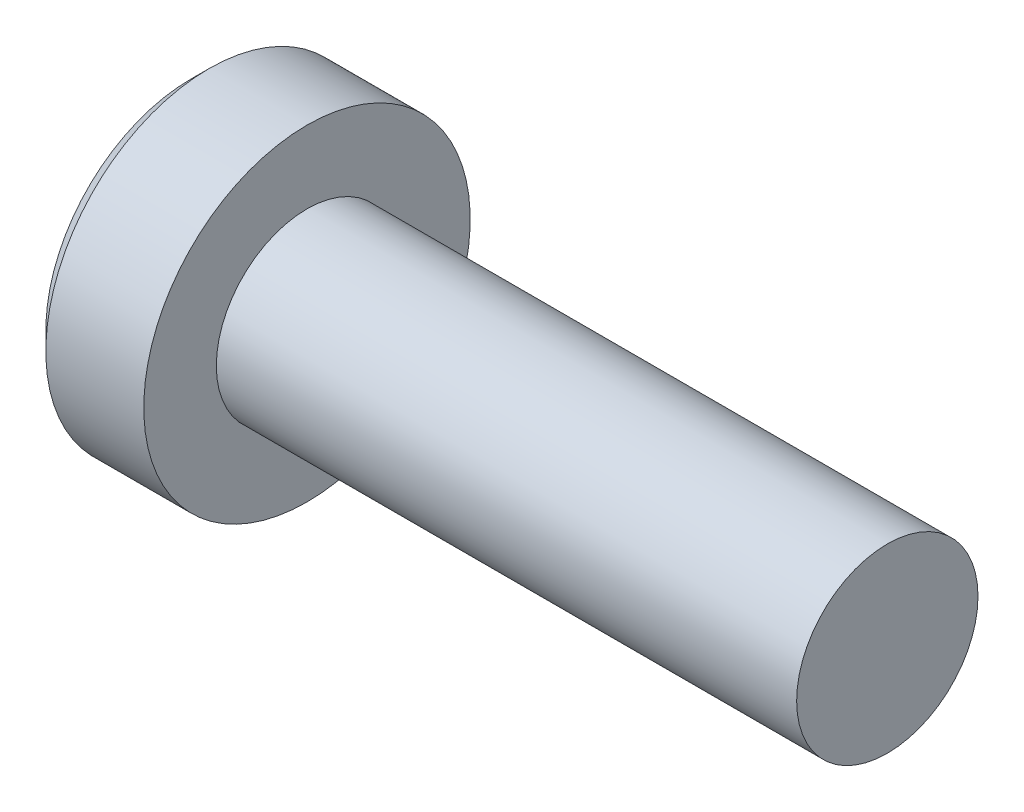
ISO-10303-21;
HEADER;
FILE_DESCRIPTION(('STEP AP214'),'2;1');
FILE_NAME('part.step','',(''),(''),'','','');
FILE_SCHEMA(('AUTOMOTIVE_DESIGN { 1 0 10303 214 1 1 1 1 }'));
ENDSEC;
DATA;
#1=APPLICATION_CONTEXT('core data for automotive mechanical design processes');
#2=APPLICATION_PROTOCOL_DEFINITION('international standard','automotive_design',2000,#1);
#3=PRODUCT_CONTEXT('',#1,'mechanical');
#4=PRODUCT('Part','Part','',(#3));
#5=PRODUCT_RELATED_PRODUCT_CATEGORY('part','',(#4));
#6=PRODUCT_DEFINITION_FORMATION('','',#4);
#7=PRODUCT_DEFINITION_CONTEXT('part definition',#1,'design');
#8=PRODUCT_DEFINITION('design','',#6,#7);
#9=PRODUCT_DEFINITION_SHAPE('','',#8);
#10=(LENGTH_UNIT() NAMED_UNIT(*) SI_UNIT(.MILLI.,.METRE.));
#11=(NAMED_UNIT(*) PLANE_ANGLE_UNIT() SI_UNIT($,.RADIAN.));
#12=(NAMED_UNIT(*) SI_UNIT($,.STERADIAN.) SOLID_ANGLE_UNIT());
#13=UNCERTAINTY_MEASURE_WITH_UNIT(LENGTH_MEASURE(1.E-05),#10,'distance_accuracy_value','');
#14=(GEOMETRIC_REPRESENTATION_CONTEXT(3) GLOBAL_UNCERTAINTY_ASSIGNED_CONTEXT((#13)) GLOBAL_UNIT_ASSIGNED_CONTEXT((#10,
#11,#12)) REPRESENTATION_CONTEXT('',''));
#15=CARTESIAN_POINT('',(0.,0.,0.));
#16=DIRECTION('',(0.,0.,1.));
#17=DIRECTION('',(1.,0.,0.));
#18=AXIS2_PLACEMENT_3D('',#15,#16,#17);
#19=CARTESIAN_POINT('',(-0.5,0.,0.));
#20=DIRECTION('',(-1.,0.,0.));
#21=DIRECTION('',(0.,0.,1.));
#22=AXIS2_PLACEMENT_3D('',#19,#20,#21);
#23=PLANE('',#22);
#24=CARTESIAN_POINT('',(-0.5,0.,0.));
#25=DIRECTION('',(-1.,0.,0.));
#26=DIRECTION('',(0.,-1.,0.));
#27=AXIS2_PLACEMENT_3D('',#24,#25,#26);
#28=CIRCLE('',#27,1.);
#29=CARTESIAN_POINT('',(-0.5,-0.866025403784439,0.5));
#30=VERTEX_POINT('',#29);
#31=CARTESIAN_POINT('',(-0.5,0.,1.));
#32=VERTEX_POINT('',#31);
#33=EDGE_CURVE('E187',#30,#32,#28,.T.);
#34=ORIENTED_EDGE('',*,*,#33,.F.);
#35=DIRECTION('',(0.,0.5,0.866025403784439));
#36=VECTOR('',#35,1.);
#37=CARTESIAN_POINT('',(-0.5,-1.15470053837925,0.));
#38=LINE('',#37,#36);
#39=CARTESIAN_POINT('',(-0.5,-0.577350269189627,0.999999999999999));
#40=VERTEX_POINT('',#39);
#41=EDGE_CURVE('E247',#30,#40,#38,.T.);
#42=ORIENTED_EDGE('',*,*,#41,.T.);
#43=DIRECTION('',(0.,1.,0.));
#44=VECTOR('',#43,1.);
#45=CARTESIAN_POINT('',(-0.5,-0.577350269189627,0.999999999999999));
#46=LINE('',#45,#44);
#47=EDGE_CURVE('E206',#40,#32,#46,.T.);
#48=ORIENTED_EDGE('',*,*,#47,.T.);
#49=EDGE_LOOP('',(#34,#42,#48));
#50=FACE_BOUND('',#49,.T.);
#51=ADVANCED_FACE('F38',(#50),#23,.T.);
#52=CARTESIAN_POINT('',(-0.5,0.866025403784439,0.5));
#53=VERTEX_POINT('',#52);
#54=EDGE_CURVE('E193',#32,#53,#28,.T.);
#55=ORIENTED_EDGE('',*,*,#54,.F.);
#56=CARTESIAN_POINT('',(-0.5,0.577350269189627,0.999999999999999));
#57=VERTEX_POINT('',#56);
#58=EDGE_CURVE('E240',#32,#57,#46,.T.);
#59=ORIENTED_EDGE('',*,*,#58,.T.);
#60=DIRECTION('',(0.,0.5,-0.866025403784439));
#61=VECTOR('',#60,1.);
#62=CARTESIAN_POINT('',(-0.5,0.577350269189627,0.999999999999999));
#63=LINE('',#62,#61);
#64=EDGE_CURVE('E261',#57,#53,#63,.T.);
#65=ORIENTED_EDGE('',*,*,#64,.T.);
#66=EDGE_LOOP('',(#55,#59,#65));
#67=FACE_BOUND('',#66,.T.);
#68=ADVANCED_FACE('F125',(#67),#23,.T.);
#69=CARTESIAN_POINT('',(-0.5,0.866025403784439,-0.5));
#70=VERTEX_POINT('',#69);
#71=EDGE_CURVE('E195',#53,#70,#28,.T.);
#72=ORIENTED_EDGE('',*,*,#71,.F.);
#73=CARTESIAN_POINT('',(-0.5,1.15470053837925,0.));
#74=VERTEX_POINT('',#73);
#75=EDGE_CURVE('E220',#53,#74,#63,.T.);
#76=ORIENTED_EDGE('',*,*,#75,.T.);
#77=DIRECTION('',(0.,-0.5,-0.866025403784439));
#78=VECTOR('',#77,1.);
#79=CARTESIAN_POINT('',(-0.5,1.15470053837925,0.));
#80=LINE('',#79,#78);
#81=EDGE_CURVE('E258',#74,#70,#80,.T.);
#82=ORIENTED_EDGE('',*,*,#81,.T.);
#83=EDGE_LOOP('',(#72,#76,#82));
#84=FACE_BOUND('',#83,.T.);
#85=ADVANCED_FACE('F130',(#84),#23,.T.);
#86=CARTESIAN_POINT('',(-0.5,0.,-1.));
#87=VERTEX_POINT('',#86);
#88=EDGE_CURVE('E198',#70,#87,#28,.T.);
#89=ORIENTED_EDGE('',*,*,#88,.F.);
#90=CARTESIAN_POINT('',(-0.5,0.577350269189626,-1.));
#91=VERTEX_POINT('',#90);
#92=EDGE_CURVE('E260',#70,#91,#80,.T.);
#93=ORIENTED_EDGE('',*,*,#92,.T.);
#94=DIRECTION('',(0.,-1.,0.));
#95=VECTOR('',#94,1.);
#96=CARTESIAN_POINT('',(-0.5,0.577350269189626,-1.));
#97=LINE('',#96,#95);
#98=EDGE_CURVE('E254',#91,#87,#97,.T.);
#99=ORIENTED_EDGE('',*,*,#98,.T.);
#100=EDGE_LOOP('',(#89,#93,#99));
#101=FACE_BOUND('',#100,.T.);
#102=ADVANCED_FACE('F177',(#101),#23,.T.);
#103=CARTESIAN_POINT('',(-0.5,-0.866025403784439,-0.5));
#104=VERTEX_POINT('',#103);
#105=EDGE_CURVE('E53',#87,#104,#28,.T.);
#106=ORIENTED_EDGE('',*,*,#105,.F.);
#107=CARTESIAN_POINT('',(-0.5,-0.577350269189626,-1.));
#108=VERTEX_POINT('',#107);
#109=EDGE_CURVE('E257',#87,#108,#97,.T.);
#110=ORIENTED_EDGE('',*,*,#109,.T.);
#111=DIRECTION('',(0.,-0.5,0.866025403784439));
#112=VECTOR('',#111,1.);
#113=CARTESIAN_POINT('',(-0.5,-0.577350269189626,-1.));
#114=LINE('',#113,#112);
#115=EDGE_CURVE('E249',#108,#104,#114,.T.);
#116=ORIENTED_EDGE('',*,*,#115,.T.);
#117=EDGE_LOOP('',(#106,#110,#116));
#118=FACE_BOUND('',#117,.T.);
#119=ADVANCED_FACE('F123',(#118),#23,.T.);
#120=CARTESIAN_POINT('',(8.,0.,0.));
#121=DIRECTION('',(-1.,0.,0.));
#122=DIRECTION('',(0.,-1.,0.));
#123=AXIS2_PLACEMENT_3D('',#120,#121,#122);
#124=PLANE('',#123);
#125=CARTESIAN_POINT('',(8.,0.,0.));
#126=DIRECTION('',(-1.,0.,0.));
#127=DIRECTION('',(0.,-1.,0.));
#128=AXIS2_PLACEMENT_3D('',#125,#126,#127);
#129=CIRCLE('',#128,1.25);
#130=CARTESIAN_POINT('',(8.,-1.25,0.));
#131=VERTEX_POINT('',#130);
#132=EDGE_CURVE('E181',#131,#131,#129,.T.);
#133=ORIENTED_EDGE('',*,*,#132,.F.);
#134=EDGE_LOOP('',(#133));
#135=FACE_BOUND('',#134,.T.);
#136=ADVANCED_FACE('F170',(#135),#124,.F.);
#137=CARTESIAN_POINT('',(-1.6,0.,0.));
#138=DIRECTION('',(-1.,0.,0.));
#139=DIRECTION('',(0.,-1.,0.));
#140=AXIS2_PLACEMENT_3D('',#137,#138,#139);
#141=CYLINDRICAL_SURFACE('',#140,1.25);
#142=CARTESIAN_POINT('',(0.,0.,0.));
#143=DIRECTION('',(-1.,0.,0.));
#144=DIRECTION('',(0.,-1.,0.));
#145=AXIS2_PLACEMENT_3D('',#142,#143,#144);
#146=CIRCLE('',#145,1.25);
#147=CARTESIAN_POINT('',(0.,-1.25,0.));
#148=VERTEX_POINT('',#147);
#149=EDGE_CURVE('E184',#148,#148,#146,.T.);
#150=ORIENTED_EDGE('',*,*,#149,.F.);
#151=EDGE_LOOP('',(#150));
#152=FACE_BOUND('',#151,.T.);
#153=ORIENTED_EDGE('',*,*,#132,.T.);
#154=EDGE_LOOP('',(#153));
#155=FACE_BOUND('',#154,.T.);
#156=ADVANCED_FACE('F167',(#152,#155),#141,.T.);
#157=CARTESIAN_POINT('',(0.,1.25,0.));
#158=DIRECTION('',(-1.,0.,0.));
#159=DIRECTION('',(0.,-1.,0.));
#160=AXIS2_PLACEMENT_3D('',#157,#158,#159);
#161=PLANE('',#160);
#162=CARTESIAN_POINT('',(0.,0.,0.));
#163=DIRECTION('',(-1.,0.,0.));
#164=DIRECTION('',(0.,-1.,0.));
#165=AXIS2_PLACEMENT_3D('',#162,#163,#164);
#166=CIRCLE('',#165,2.25);
#167=CARTESIAN_POINT('',(0.,-2.25,0.));
#168=VERTEX_POINT('',#167);
#169=EDGE_CURVE('E189',#168,#168,#166,.T.);
#170=ORIENTED_EDGE('',*,*,#169,.F.);
#171=EDGE_LOOP('',(#170));
#172=FACE_BOUND('',#171,.T.);
#173=ORIENTED_EDGE('',*,*,#149,.T.);
#174=EDGE_LOOP('',(#173));
#175=FACE_BOUND('',#174,.T.);
#176=ADVANCED_FACE('F163',(#172,#175),#161,.F.);
#177=CARTESIAN_POINT('',(-1.6,0.,0.));
#178=DIRECTION('',(-1.,0.,0.));
#179=DIRECTION('',(0.,-1.,0.));
#180=AXIS2_PLACEMENT_3D('',#177,#178,#179);
#181=CYLINDRICAL_SURFACE('',#180,2.25);
#182=CARTESIAN_POINT('',(-1.35,0.,0.));
#183=DIRECTION('',(1.,0.,0.));
#184=DIRECTION('',(0.,1.,0.));
#185=AXIS2_PLACEMENT_3D('',#182,#183,#184);
#186=CIRCLE('',#185,2.25);
#187=CARTESIAN_POINT('',(-1.35,2.25,0.));
#188=VERTEX_POINT('',#187);
#189=EDGE_CURVE('E11',#188,#188,#186,.T.);
#190=ORIENTED_EDGE('',*,*,#189,.T.);
#191=EDGE_LOOP('',(#190));
#192=FACE_BOUND('',#191,.T.);
#193=ORIENTED_EDGE('',*,*,#169,.T.);
#194=EDGE_LOOP('',(#193));
#195=FACE_BOUND('',#194,.T.);
#196=ADVANCED_FACE('F159',(#192,#195),#181,.T.);
#197=CARTESIAN_POINT('',(-1.6,2.25,0.));
#198=DIRECTION('',(1.,0.,0.));
#199=DIRECTION('',(0.,1.,0.));
#200=AXIS2_PLACEMENT_3D('',#197,#198,#199);
#201=PLANE('',#200);
#202=CARTESIAN_POINT('',(-1.6,0.,0.));
#203=DIRECTION('',(1.,0.,0.));
#204=DIRECTION('',(0.,1.,0.));
#205=AXIS2_PLACEMENT_3D('',#202,#203,#204);
#206=CIRCLE('',#205,2.);
#207=CARTESIAN_POINT('',(-1.6,2.,0.));
#208=VERTEX_POINT('',#207);
#209=EDGE_CURVE('E46',#208,#208,#206,.F.);
#210=ORIENTED_EDGE('',*,*,#209,.T.);
#211=EDGE_LOOP('',(#210));
#212=FACE_BOUND('',#211,.T.);
#213=DIRECTION('',(0.,-0.5,-0.866025403784439));
#214=VECTOR('',#213,1.);
#215=CARTESIAN_POINT('',(-1.6,1.15470053837925,0.));
#216=LINE('',#215,#214);
#217=CARTESIAN_POINT('',(-1.6,1.15470053837925,0.));
#218=VERTEX_POINT('',#217);
#219=CARTESIAN_POINT('',(-1.6,0.577350269189626,-1.));
#220=VERTEX_POINT('',#219);
#221=EDGE_CURVE('E200',#218,#220,#216,.T.);
#222=ORIENTED_EDGE('',*,*,#221,.F.);
#223=DIRECTION('',(0.,0.5,-0.866025403784439));
#224=VECTOR('',#223,1.);
#225=CARTESIAN_POINT('',(-1.6,0.577350269189627,0.999999999999999));
#226=LINE('',#225,#224);
#227=CARTESIAN_POINT('',(-1.6,0.577350269189627,0.999999999999999));
#228=VERTEX_POINT('',#227);
#229=EDGE_CURVE('E61',#228,#218,#226,.T.);
#230=ORIENTED_EDGE('',*,*,#229,.F.);
#231=DIRECTION('',(0.,1.,0.));
#232=VECTOR('',#231,1.);
#233=CARTESIAN_POINT('',(-1.6,-0.577350269189627,0.999999999999999));
#234=LINE('',#233,#232);
#235=CARTESIAN_POINT('',(-1.6,-0.577350269189627,0.999999999999999));
#236=VERTEX_POINT('',#235);
#237=EDGE_CURVE('E217',#236,#228,#234,.T.);
#238=ORIENTED_EDGE('',*,*,#237,.F.);
#239=DIRECTION('',(0.,0.5,0.866025403784439));
#240=VECTOR('',#239,1.);
#241=CARTESIAN_POINT('',(-1.6,-1.15470053837925,0.));
#242=LINE('',#241,#240);
#243=CARTESIAN_POINT('',(-1.6,-1.15470053837925,0.));
#244=VERTEX_POINT('',#243);
#245=EDGE_CURVE('E214',#244,#236,#242,.T.);
#246=ORIENTED_EDGE('',*,*,#245,.F.);
#247=DIRECTION('',(0.,-0.5,0.866025403784439));
#248=VECTOR('',#247,1.);
#249=CARTESIAN_POINT('',(-1.6,-0.577350269189626,-1.));
#250=LINE('',#249,#248);
#251=CARTESIAN_POINT('',(-1.6,-0.577350269189626,-1.));
#252=VERTEX_POINT('',#251);
#253=EDGE_CURVE('E211',#252,#244,#250,.T.);
#254=ORIENTED_EDGE('',*,*,#253,.F.);
#255=DIRECTION('',(0.,-1.,0.));
#256=VECTOR('',#255,1.);
#257=CARTESIAN_POINT('',(-1.6,0.577350269189626,-1.));
#258=LINE('',#257,#256);
#259=EDGE_CURVE('E203',#220,#252,#258,.T.);
#260=ORIENTED_EDGE('',*,*,#259,.F.);
#261=EDGE_LOOP('',(#222,#230,#238,#246,#254,#260));
#262=FACE_BOUND('',#261,.T.);
#263=ADVANCED_FACE('F156',(#212,#262),#201,.F.);
#264=CARTESIAN_POINT('',(-0.5,0.577350269189627,0.999999999999999));
#265=DIRECTION('',(0.,0.866025403784439,0.5));
#266=DIRECTION('',(0.,-0.5,0.866025403784439));
#267=AXIS2_PLACEMENT_3D('',#264,#265,#266);
#268=PLANE('',#267);
#269=ORIENTED_EDGE('',*,*,#229,.T.);
#270=DIRECTION('',(-1.,0.,0.));
#271=VECTOR('',#270,1.);
#272=CARTESIAN_POINT('',(-0.5,1.15470053837925,0.));
#273=LINE('',#272,#271);
#274=EDGE_CURVE('E231',#74,#218,#273,.T.);
#275=ORIENTED_EDGE('',*,*,#274,.F.);
#276=ORIENTED_EDGE('',*,*,#75,.F.);
#277=ORIENTED_EDGE('',*,*,#64,.F.);
#278=DIRECTION('',(-1.,0.,0.));
#279=VECTOR('',#278,1.);
#280=CARTESIAN_POINT('',(-0.5,0.577350269189627,0.999999999999999));
#281=LINE('',#280,#279);
#282=EDGE_CURVE('E221',#57,#228,#281,.T.);
#283=ORIENTED_EDGE('',*,*,#282,.T.);
#284=EDGE_LOOP('',(#269,#275,#276,#277,#283));
#285=FACE_BOUND('',#284,.T.);
#286=ADVANCED_FACE('F138',(#285),#268,.F.);
#287=CARTESIAN_POINT('',(-0.5,-0.577350269189627,0.999999999999999));
#288=DIRECTION('',(0.,0.,1.));
#289=DIRECTION('',(0.,-1.,0.));
#290=AXIS2_PLACEMENT_3D('',#287,#288,#289);
#291=PLANE('',#290);
#292=ORIENTED_EDGE('',*,*,#237,.T.);
#293=ORIENTED_EDGE('',*,*,#282,.F.);
#294=ORIENTED_EDGE('',*,*,#58,.F.);
#295=ORIENTED_EDGE('',*,*,#47,.F.);
#296=DIRECTION('',(-1.,0.,0.));
#297=VECTOR('',#296,1.);
#298=CARTESIAN_POINT('',(-0.5,-0.577350269189627,0.999999999999999));
#299=LINE('',#298,#297);
#300=EDGE_CURVE('E223',#40,#236,#299,.T.);
#301=ORIENTED_EDGE('',*,*,#300,.T.);
#302=EDGE_LOOP('',(#292,#293,#294,#295,#301));
#303=FACE_BOUND('',#302,.T.);
#304=ADVANCED_FACE('F134',(#303),#291,.F.);
#305=CARTESIAN_POINT('',(-0.5,-1.15470053837925,0.));
#306=DIRECTION('',(0.,-0.866025403784439,0.5));
#307=DIRECTION('',(0.,-0.5,-0.866025403784439));
#308=AXIS2_PLACEMENT_3D('',#305,#306,#307);
#309=PLANE('',#308);
#310=ORIENTED_EDGE('',*,*,#245,.T.);
#311=ORIENTED_EDGE('',*,*,#300,.F.);
#312=ORIENTED_EDGE('',*,*,#41,.F.);
#313=CARTESIAN_POINT('',(-0.5,-1.15470053837925,0.));
#314=VERTEX_POINT('',#313);
#315=EDGE_CURVE('E242',#314,#30,#38,.T.);
#316=ORIENTED_EDGE('',*,*,#315,.F.);
#317=DIRECTION('',(-1.,0.,0.));
#318=VECTOR('',#317,1.);
#319=CARTESIAN_POINT('',(-0.5,-1.15470053837925,0.));
#320=LINE('',#319,#318);
#321=EDGE_CURVE('E225',#314,#244,#320,.T.);
#322=ORIENTED_EDGE('',*,*,#321,.T.);
#323=EDGE_LOOP('',(#310,#311,#312,#316,#322));
#324=FACE_BOUND('',#323,.T.);
#325=ADVANCED_FACE('F137',(#324),#309,.F.);
#326=CARTESIAN_POINT('',(-0.5,-0.577350269189626,-1.));
#327=DIRECTION('',(0.,-0.866025403784439,-0.5));
#328=DIRECTION('',(0.,0.5,-0.866025403784439));
#329=AXIS2_PLACEMENT_3D('',#326,#327,#328);
#330=PLANE('',#329);
#331=ORIENTED_EDGE('',*,*,#253,.T.);
#332=ORIENTED_EDGE('',*,*,#321,.F.);
#333=EDGE_CURVE('E253',#104,#314,#114,.T.);
#334=ORIENTED_EDGE('',*,*,#333,.F.);
#335=ORIENTED_EDGE('',*,*,#115,.F.);
#336=DIRECTION('',(-1.,0.,0.));
#337=VECTOR('',#336,1.);
#338=CARTESIAN_POINT('',(-0.5,-0.577350269189626,-1.));
#339=LINE('',#338,#337);
#340=EDGE_CURVE('E227',#108,#252,#339,.T.);
#341=ORIENTED_EDGE('',*,*,#340,.T.);
#342=EDGE_LOOP('',(#331,#332,#334,#335,#341));
#343=FACE_BOUND('',#342,.T.);
#344=ADVANCED_FACE('F142',(#343),#330,.F.);
#345=CARTESIAN_POINT('',(-0.5,0.577350269189626,-1.));
#346=DIRECTION('',(0.,0.,-1.));
#347=DIRECTION('',(0.,1.,0.));
#348=AXIS2_PLACEMENT_3D('',#345,#346,#347);
#349=PLANE('',#348);
#350=ORIENTED_EDGE('',*,*,#259,.T.);
#351=ORIENTED_EDGE('',*,*,#340,.F.);
#352=ORIENTED_EDGE('',*,*,#109,.F.);
#353=ORIENTED_EDGE('',*,*,#98,.F.);
#354=DIRECTION('',(-1.,0.,0.));
#355=VECTOR('',#354,1.);
#356=CARTESIAN_POINT('',(-0.5,0.577350269189626,-1.));
#357=LINE('',#356,#355);
#358=EDGE_CURVE('E229',#91,#220,#357,.T.);
#359=ORIENTED_EDGE('',*,*,#358,.T.);
#360=EDGE_LOOP('',(#350,#351,#352,#353,#359));
#361=FACE_BOUND('',#360,.T.);
#362=ADVANCED_FACE('F146',(#361),#349,.F.);
#363=CARTESIAN_POINT('',(-0.5,1.15470053837925,0.));
#364=DIRECTION('',(0.,0.866025403784439,-0.5));
#365=DIRECTION('',(0.,0.5,0.866025403784439));
#366=AXIS2_PLACEMENT_3D('',#363,#364,#365);
#367=PLANE('',#366);
#368=ORIENTED_EDGE('',*,*,#221,.T.);
#369=ORIENTED_EDGE('',*,*,#358,.F.);
#370=ORIENTED_EDGE('',*,*,#92,.F.);
#371=ORIENTED_EDGE('',*,*,#81,.F.);
#372=ORIENTED_EDGE('',*,*,#274,.T.);
#373=EDGE_LOOP('',(#368,#369,#370,#371,#372));
#374=FACE_BOUND('',#373,.T.);
#375=ADVANCED_FACE('F120',(#374),#367,.F.);
#376=EDGE_CURVE('E183',#104,#30,#28,.T.);
#377=ORIENTED_EDGE('',*,*,#376,.F.);
#378=ORIENTED_EDGE('',*,*,#333,.T.);
#379=ORIENTED_EDGE('',*,*,#315,.T.);
#380=EDGE_LOOP('',(#377,#378,#379));
#381=FACE_BOUND('',#380,.T.);
#382=ADVANCED_FACE('F113',(#381),#23,.T.);
#383=CARTESIAN_POINT('',(0.0773502691896188,0.,0.));
#384=DIRECTION('',(-1.,0.,0.));
#385=DIRECTION('',(0.,-1.,0.));
#386=AXIS2_PLACEMENT_3D('',#383,#384,#385);
#387=CONICAL_SURFACE('',#386,0.,1.0471975511966);
#388=ORIENTED_EDGE('',*,*,#33,.T.);
#389=ORIENTED_EDGE('',*,*,#54,.T.);
#390=ORIENTED_EDGE('',*,*,#71,.T.);
#391=ORIENTED_EDGE('',*,*,#88,.T.);
#392=ORIENTED_EDGE('',*,*,#105,.T.);
#393=ORIENTED_EDGE('',*,*,#376,.T.);
#394=EDGE_LOOP('',(#388,#389,#390,#391,#392,#393));
#395=FACE_BOUND('',#394,.T.);
#396=CARTESIAN_POINT('',(0.0773502691896188,0.,0.));
#397=VERTEX_POINT('',#396);
#398=VERTEX_LOOP('',#397);
#399=FACE_BOUND('',#398,.T.);
#400=ADVANCED_FACE('F111',(#395,#399),#387,.F.);
#401=CARTESIAN_POINT('',(-1.6,0.,0.));
#402=DIRECTION('',(1.,0.,0.));
#403=DIRECTION('',(0.,1.,0.));
#404=AXIS2_PLACEMENT_3D('',#401,#402,#403);
#405=CONICAL_SURFACE('',#404,2.,0.785398163397443);
#406=ORIENTED_EDGE('',*,*,#189,.F.);
#407=EDGE_LOOP('',(#406));
#408=FACE_BOUND('',#407,.T.);
#409=ORIENTED_EDGE('',*,*,#209,.F.);
#410=EDGE_LOOP('',(#409));
#411=FACE_BOUND('',#410,.T.);
#412=ADVANCED_FACE('F40',(#408,#411),#405,.T.);
#413=CLOSED_SHELL('',(#51,#68,#85,#102,#119,#136,#156,#176,#196,#263,#286,#304,#325,#344,#362,
#375,#382,#400,#412));
#414=MANIFOLD_SOLID_BREP('B2',#413);
#415=ADVANCED_BREP_SHAPE_REPRESENTATION('',(#18,#414),#14);
#416=SHAPE_DEFINITION_REPRESENTATION(#9,#415);
ENDSEC;
END-ISO-10303-21;
